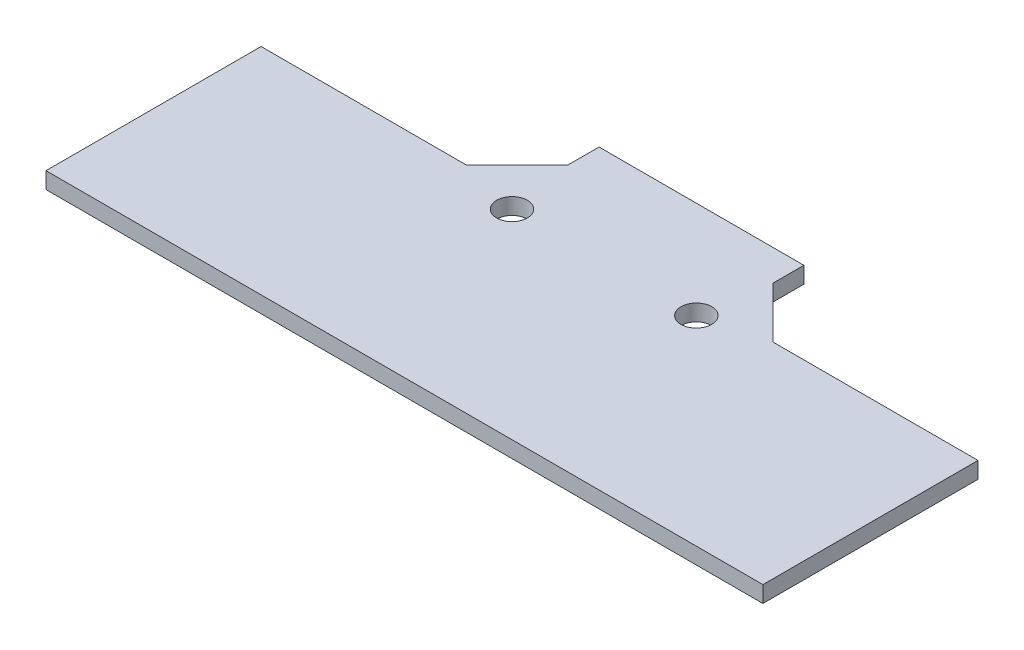
ISO-10303-21;
HEADER;
FILE_DESCRIPTION(('STEP AP214'),'2;1');
FILE_NAME('part.step','',(''),(''),'','','');
FILE_SCHEMA(('AUTOMOTIVE_DESIGN { 1 0 10303 214 1 1 1 1 }'));
ENDSEC;
DATA;
#1=APPLICATION_CONTEXT('core data for automotive mechanical design processes');
#2=APPLICATION_PROTOCOL_DEFINITION('international standard','automotive_design',2000,#1);
#3=PRODUCT_CONTEXT('',#1,'mechanical');
#4=PRODUCT('Part','Part','',(#3));
#5=PRODUCT_RELATED_PRODUCT_CATEGORY('part','',(#4));
#6=PRODUCT_DEFINITION_FORMATION('','',#4);
#7=PRODUCT_DEFINITION_CONTEXT('part definition',#1,'design');
#8=PRODUCT_DEFINITION('design','',#6,#7);
#9=PRODUCT_DEFINITION_SHAPE('','',#8);
#10=(LENGTH_UNIT() NAMED_UNIT(*) SI_UNIT(.MILLI.,.METRE.));
#11=(NAMED_UNIT(*) PLANE_ANGLE_UNIT() SI_UNIT($,.RADIAN.));
#12=(NAMED_UNIT(*) SI_UNIT($,.STERADIAN.) SOLID_ANGLE_UNIT());
#13=UNCERTAINTY_MEASURE_WITH_UNIT(LENGTH_MEASURE(1.E-05),#10,'distance_accuracy_value','');
#14=(GEOMETRIC_REPRESENTATION_CONTEXT(3) GLOBAL_UNCERTAINTY_ASSIGNED_CONTEXT((#13)) GLOBAL_UNIT_ASSIGNED_CONTEXT((#10,
#11,#12)) REPRESENTATION_CONTEXT('',''));
#15=CARTESIAN_POINT('',(0.,0.,0.));
#16=DIRECTION('',(0.,0.,1.));
#17=DIRECTION('',(1.,0.,0.));
#18=AXIS2_PLACEMENT_3D('',#15,#16,#17);
#19=CARTESIAN_POINT('',(0.,1.6,-15.6455542021924));
#20=DIRECTION('',(0.,0.,-1.));
#21=DIRECTION('',(-1.,0.,0.));
#22=AXIS2_PLACEMENT_3D('',#19,#20,#21);
#23=PLANE('',#22);
#24=DIRECTION('',(1.,0.,0.));
#25=VECTOR('',#24,1.);
#26=CARTESIAN_POINT('',(0.,0.,-15.6455542021924));
#27=LINE('',#26,#25);
#28=CARTESIAN_POINT('',(15.2984165651644,0.,-15.6455542021924));
#29=VERTEX_POINT('',#28);
#30=CARTESIAN_POINT('',(35.2984165651644,0.,-15.6455542021924));
#31=VERTEX_POINT('',#30);
#32=EDGE_CURVE('E189',#29,#31,#27,.T.);
#33=ORIENTED_EDGE('',*,*,#32,.F.);
#34=DIRECTION('',(0.,-1.,0.));
#35=VECTOR('',#34,1.);
#36=CARTESIAN_POINT('',(15.2984165651644,1.6,-15.6455542021924));
#37=LINE('',#36,#35);
#38=CARTESIAN_POINT('',(15.2984165651644,1.6,-15.6455542021924));
#39=VERTEX_POINT('',#38);
#40=EDGE_CURVE('E11',#39,#29,#37,.T.);
#41=ORIENTED_EDGE('',*,*,#40,.F.);
#42=DIRECTION('',(1.,0.,0.));
#43=VECTOR('',#42,1.);
#44=CARTESIAN_POINT('',(0.,1.6,-15.6455542021924));
#45=LINE('',#44,#43);
#46=CARTESIAN_POINT('',(35.2984165651644,1.6,-15.6455542021924));
#47=VERTEX_POINT('',#46);
#48=EDGE_CURVE('E283',#39,#47,#45,.T.);
#49=ORIENTED_EDGE('',*,*,#48,.T.);
#50=DIRECTION('',(0.,-1.,0.));
#51=VECTOR('',#50,1.);
#52=CARTESIAN_POINT('',(35.2984165651644,1.6,-15.6455542021924));
#53=LINE('',#52,#51);
#54=EDGE_CURVE('E59',#47,#31,#53,.T.);
#55=ORIENTED_EDGE('',*,*,#54,.T.);
#56=EDGE_LOOP('',(#33,#41,#49,#55));
#57=FACE_BOUND('',#56,.T.);
#58=ADVANCED_FACE('F41',(#57),#23,.T.);
#59=CARTESIAN_POINT('',(15.4719853836784,1.6,-15.4719853836784));
#60=DIRECTION('',(0.707106781186548,0.,-0.707106781186548));
#61=DIRECTION('',(-0.707106781186548,0.,-0.707106781186548));
#62=AXIS2_PLACEMENT_3D('',#59,#60,#61);
#63=PLANE('',#62);
#64=DIRECTION('',(0.707106781186548,0.,0.707106781186548));
#65=VECTOR('',#64,1.);
#66=CARTESIAN_POINT('',(15.4719853836784,0.,-15.4719853836784));
#67=LINE('',#66,#65);
#68=CARTESIAN_POINT('',(10.2984165651644,0.,-20.6455542021924));
#69=VERTEX_POINT('',#68);
#70=EDGE_CURVE('E181',#69,#29,#67,.T.);
#71=ORIENTED_EDGE('',*,*,#70,.F.);
#72=DIRECTION('',(0.,-1.,0.));
#73=VECTOR('',#72,1.);
#74=CARTESIAN_POINT('',(10.2984165651644,1.6,-20.6455542021924));
#75=LINE('',#74,#73);
#76=CARTESIAN_POINT('',(10.2984165651644,1.6,-20.6455542021924));
#77=VERTEX_POINT('',#76);
#78=EDGE_CURVE('E51',#77,#69,#75,.T.);
#79=ORIENTED_EDGE('',*,*,#78,.F.);
#80=DIRECTION('',(0.707106781186548,0.,0.707106781186548));
#81=VECTOR('',#80,1.);
#82=CARTESIAN_POINT('',(15.4719853836784,1.6,-15.4719853836784));
#83=LINE('',#82,#81);
#84=EDGE_CURVE('E287',#77,#39,#83,.T.);
#85=ORIENTED_EDGE('',*,*,#84,.T.);
#86=ORIENTED_EDGE('',*,*,#40,.T.);
#87=EDGE_LOOP('',(#71,#79,#85,#86));
#88=FACE_BOUND('',#87,.T.);
#89=ADVANCED_FACE('F187',(#88),#63,.T.);
#90=CARTESIAN_POINT('',(10.2984165651644,1.6,0.));
#91=DIRECTION('',(-1.,0.,0.));
#92=DIRECTION('',(0.,0.,1.));
#93=AXIS2_PLACEMENT_3D('',#90,#91,#92);
#94=PLANE('',#93);
#95=DIRECTION('',(0.,0.,-1.));
#96=VECTOR('',#95,1.);
#97=CARTESIAN_POINT('',(10.2984165651644,0.,0.));
#98=LINE('',#97,#96);
#99=CARTESIAN_POINT('',(10.2984165651644,0.,-23.6455542021924));
#100=VERTEX_POINT('',#99);
#101=EDGE_CURVE('E171',#69,#100,#98,.T.);
#102=ORIENTED_EDGE('',*,*,#101,.T.);
#103=DIRECTION('',(0.,-1.,0.));
#104=VECTOR('',#103,1.);
#105=CARTESIAN_POINT('',(10.2984165651644,1.6,-23.6455542021924));
#106=LINE('',#105,#104);
#107=CARTESIAN_POINT('',(10.2984165651644,1.6,-23.6455542021924));
#108=VERTEX_POINT('',#107);
#109=EDGE_CURVE('E162',#108,#100,#106,.T.);
#110=ORIENTED_EDGE('',*,*,#109,.F.);
#111=DIRECTION('',(0.,0.,-1.));
#112=VECTOR('',#111,1.);
#113=CARTESIAN_POINT('',(10.2984165651644,1.6,0.));
#114=LINE('',#113,#112);
#115=EDGE_CURVE('E173',#77,#108,#114,.T.);
#116=ORIENTED_EDGE('',*,*,#115,.F.);
#117=ORIENTED_EDGE('',*,*,#78,.T.);
#118=EDGE_LOOP('',(#102,#110,#116,#117));
#119=FACE_BOUND('',#118,.T.);
#120=ADVANCED_FACE('F169',(#119),#94,.F.);
#121=CARTESIAN_POINT('',(0.,1.6,-23.6455542021924));
#122=DIRECTION('',(0.,0.,-1.));
#123=DIRECTION('',(-1.,0.,0.));
#124=AXIS2_PLACEMENT_3D('',#121,#122,#123);
#125=PLANE('',#124);
#126=DIRECTION('',(1.,0.,0.));
#127=VECTOR('',#126,1.);
#128=CARTESIAN_POINT('',(0.,0.,-23.6455542021924));
#129=LINE('',#128,#127);
#130=CARTESIAN_POINT('',(-9.70158343483557,0.,-23.6455542021924));
#131=VERTEX_POINT('',#130);
#132=EDGE_CURVE('E184',#131,#100,#129,.T.);
#133=ORIENTED_EDGE('',*,*,#132,.F.);
#134=DIRECTION('',(0.,-1.,0.));
#135=VECTOR('',#134,1.);
#136=CARTESIAN_POINT('',(-9.70158343483557,1.6,-23.6455542021924));
#137=LINE('',#136,#135);
#138=CARTESIAN_POINT('',(-9.70158343483557,1.6,-23.6455542021924));
#139=VERTEX_POINT('',#138);
#140=EDGE_CURVE('E159',#139,#131,#137,.T.);
#141=ORIENTED_EDGE('',*,*,#140,.F.);
#142=DIRECTION('',(1.,0.,0.));
#143=VECTOR('',#142,1.);
#144=CARTESIAN_POINT('',(0.,1.6,-23.6455542021924));
#145=LINE('',#144,#143);
#146=EDGE_CURVE('E295',#139,#108,#145,.T.);
#147=ORIENTED_EDGE('',*,*,#146,.T.);
#148=ORIENTED_EDGE('',*,*,#109,.T.);
#149=EDGE_LOOP('',(#133,#141,#147,#148));
#150=FACE_BOUND('',#149,.T.);
#151=ADVANCED_FACE('F250',(#150),#125,.T.);
#152=CARTESIAN_POINT('',(-9.70158343483557,1.6,0.));
#153=DIRECTION('',(-1.,0.,0.));
#154=DIRECTION('',(0.,0.,1.));
#155=AXIS2_PLACEMENT_3D('',#152,#153,#154);
#156=PLANE('',#155);
#157=DIRECTION('',(0.,0.,-1.));
#158=VECTOR('',#157,1.);
#159=CARTESIAN_POINT('',(-9.70158343483557,0.,0.));
#160=LINE('',#159,#158);
#161=CARTESIAN_POINT('',(-9.70158343483557,0.,-20.6455542021924));
#162=VERTEX_POINT('',#161);
#163=EDGE_CURVE('E198',#162,#131,#160,.T.);
#164=ORIENTED_EDGE('',*,*,#163,.F.);
#165=DIRECTION('',(0.,-1.,0.));
#166=VECTOR('',#165,1.);
#167=CARTESIAN_POINT('',(-9.70158343483557,1.6,-20.6455542021924));
#168=LINE('',#167,#166);
#169=CARTESIAN_POINT('',(-9.70158343483557,1.6,-20.6455542021924));
#170=VERTEX_POINT('',#169);
#171=EDGE_CURVE('E156',#170,#162,#168,.T.);
#172=ORIENTED_EDGE('',*,*,#171,.F.);
#173=DIRECTION('',(0.,0.,-1.));
#174=VECTOR('',#173,1.);
#175=CARTESIAN_POINT('',(-9.70158343483557,1.6,0.));
#176=LINE('',#175,#174);
#177=EDGE_CURVE('E299',#170,#139,#176,.T.);
#178=ORIENTED_EDGE('',*,*,#177,.T.);
#179=ORIENTED_EDGE('',*,*,#140,.T.);
#180=EDGE_LOOP('',(#164,#172,#178,#179));
#181=FACE_BOUND('',#180,.T.);
#182=ADVANCED_FACE('F253',(#181),#156,.T.);
#183=CARTESIAN_POINT('',(-15.173568818514,1.6,-15.173568818514));
#184=DIRECTION('',(0.707106781186548,0.,0.707106781186548));
#185=DIRECTION('',(0.707106781186548,0.,-0.707106781186548));
#186=AXIS2_PLACEMENT_3D('',#183,#184,#185);
#187=PLANE('',#186);
#188=DIRECTION('',(-0.707106781186548,0.,0.707106781186548));
#189=VECTOR('',#188,1.);
#190=CARTESIAN_POINT('',(-15.173568818514,0.,-15.173568818514));
#191=LINE('',#190,#189);
#192=CARTESIAN_POINT('',(-14.7015834348356,0.,-15.6455542021924));
#193=VERTEX_POINT('',#192);
#194=EDGE_CURVE('E201',#162,#193,#191,.T.);
#195=ORIENTED_EDGE('',*,*,#194,.T.);
#196=DIRECTION('',(0.,-1.,0.));
#197=VECTOR('',#196,1.);
#198=CARTESIAN_POINT('',(-14.7015834348356,1.6,-15.6455542021924));
#199=LINE('',#198,#197);
#200=CARTESIAN_POINT('',(-14.7015834348356,1.6,-15.6455542021924));
#201=VERTEX_POINT('',#200);
#202=EDGE_CURVE('E149',#201,#193,#199,.T.);
#203=ORIENTED_EDGE('',*,*,#202,.F.);
#204=DIRECTION('',(-0.707106781186548,0.,0.707106781186548));
#205=VECTOR('',#204,1.);
#206=CARTESIAN_POINT('',(-15.173568818514,1.6,-15.173568818514));
#207=LINE('',#206,#205);
#208=EDGE_CURVE('E303',#170,#201,#207,.T.);
#209=ORIENTED_EDGE('',*,*,#208,.F.);
#210=ORIENTED_EDGE('',*,*,#171,.T.);
#211=EDGE_LOOP('',(#195,#203,#209,#210));
#212=FACE_BOUND('',#211,.T.);
#213=ADVANCED_FACE('F257',(#212),#187,.F.);
#214=CARTESIAN_POINT('',(0.,1.6,-15.6455542021924));
#215=DIRECTION('',(0.,0.,-1.));
#216=DIRECTION('',(-1.,0.,0.));
#217=AXIS2_PLACEMENT_3D('',#214,#215,#216);
#218=PLANE('',#217);
#219=DIRECTION('',(1.,0.,0.));
#220=VECTOR('',#219,1.);
#221=CARTESIAN_POINT('',(0.,0.,-15.6455542021924));
#222=LINE('',#221,#220);
#223=CARTESIAN_POINT('',(-34.7015834348356,0.,-15.6455542021924));
#224=VERTEX_POINT('',#223);
#225=EDGE_CURVE('E205',#224,#193,#222,.T.);
#226=ORIENTED_EDGE('',*,*,#225,.F.);
#227=DIRECTION('',(0.,-1.,0.));
#228=VECTOR('',#227,1.);
#229=CARTESIAN_POINT('',(-34.7015834348356,1.6,-15.6455542021924));
#230=LINE('',#229,#228);
#231=CARTESIAN_POINT('',(-34.7015834348356,1.6,-15.6455542021924));
#232=VERTEX_POINT('',#231);
#233=EDGE_CURVE('E145',#232,#224,#230,.T.);
#234=ORIENTED_EDGE('',*,*,#233,.F.);
#235=DIRECTION('',(1.,0.,0.));
#236=VECTOR('',#235,1.);
#237=CARTESIAN_POINT('',(0.,1.6,-15.6455542021924));
#238=LINE('',#237,#236);
#239=EDGE_CURVE('E137',#232,#201,#238,.T.);
#240=ORIENTED_EDGE('',*,*,#239,.T.);
#241=ORIENTED_EDGE('',*,*,#202,.T.);
#242=EDGE_LOOP('',(#226,#234,#240,#241));
#243=FACE_BOUND('',#242,.T.);
#244=ADVANCED_FACE('F261',(#243),#218,.T.);
#245=CARTESIAN_POINT('',(-34.7015834348356,1.6,0.));
#246=DIRECTION('',(1.,0.,0.));
#247=DIRECTION('',(0.,0.,-1.));
#248=AXIS2_PLACEMENT_3D('',#245,#246,#247);
#249=PLANE('',#248);
#250=DIRECTION('',(0.,0.,1.));
#251=VECTOR('',#250,1.);
#252=CARTESIAN_POINT('',(-34.7015834348356,0.,0.));
#253=LINE('',#252,#251);
#254=CARTESIAN_POINT('',(-34.7015834348356,0.,5.35444579780758));
#255=VERTEX_POINT('',#254);
#256=EDGE_CURVE('E143',#224,#255,#253,.T.);
#257=ORIENTED_EDGE('',*,*,#256,.T.);
#258=DIRECTION('',(0.,-1.,0.));
#259=VECTOR('',#258,1.);
#260=CARTESIAN_POINT('',(-34.7015834348356,1.6,5.35444579780758));
#261=LINE('',#260,#259);
#262=CARTESIAN_POINT('',(-34.7015834348356,1.6,5.35444579780758));
#263=VERTEX_POINT('',#262);
#264=EDGE_CURVE('E125',#263,#255,#261,.T.);
#265=ORIENTED_EDGE('',*,*,#264,.F.);
#266=DIRECTION('',(0.,0.,1.));
#267=VECTOR('',#266,1.);
#268=CARTESIAN_POINT('',(-34.7015834348356,1.6,0.));
#269=LINE('',#268,#267);
#270=EDGE_CURVE('E131',#232,#263,#269,.T.);
#271=ORIENTED_EDGE('',*,*,#270,.F.);
#272=ORIENTED_EDGE('',*,*,#233,.T.);
#273=EDGE_LOOP('',(#257,#265,#271,#272));
#274=FACE_BOUND('',#273,.T.);
#275=ADVANCED_FACE('F141',(#274),#249,.F.);
#276=CARTESIAN_POINT('',(0.,1.6,5.35444579780758));
#277=DIRECTION('',(0.,0.,-1.));
#278=DIRECTION('',(-1.,0.,0.));
#279=AXIS2_PLACEMENT_3D('',#276,#277,#278);
#280=PLANE('',#279);
#281=DIRECTION('',(1.,0.,0.));
#282=VECTOR('',#281,1.);
#283=CARTESIAN_POINT('',(0.,0.,5.35444579780758));
#284=LINE('',#283,#282);
#285=CARTESIAN_POINT('',(35.2984165651644,0.,5.35444579780758));
#286=VERTEX_POINT('',#285);
#287=EDGE_CURVE('E211',#255,#286,#284,.T.);
#288=ORIENTED_EDGE('',*,*,#287,.T.);
#289=DIRECTION('',(0.,-1.,0.));
#290=VECTOR('',#289,1.);
#291=CARTESIAN_POINT('',(35.2984165651644,1.6,5.35444579780758));
#292=LINE('',#291,#290);
#293=CARTESIAN_POINT('',(35.2984165651644,1.6,5.35444579780758));
#294=VERTEX_POINT('',#293);
#295=EDGE_CURVE('E91',#294,#286,#292,.T.);
#296=ORIENTED_EDGE('',*,*,#295,.F.);
#297=DIRECTION('',(1.,0.,0.));
#298=VECTOR('',#297,1.);
#299=CARTESIAN_POINT('',(0.,1.6,5.35444579780758));
#300=LINE('',#299,#298);
#301=EDGE_CURVE('E121',#263,#294,#300,.T.);
#302=ORIENTED_EDGE('',*,*,#301,.F.);
#303=ORIENTED_EDGE('',*,*,#264,.T.);
#304=EDGE_LOOP('',(#288,#296,#302,#303));
#305=FACE_BOUND('',#304,.T.);
#306=ADVANCED_FACE('F123',(#305),#280,.F.);
#307=CARTESIAN_POINT('',(9.29841656516443,1.6,-14.1455542021924));
#308=DIRECTION('',(0.,-1.,0.));
#309=DIRECTION('',(0.,0.,-1.));
#310=AXIS2_PLACEMENT_3D('',#307,#308,#309);
#311=CYLINDRICAL_SURFACE('',#310,1.5);
#312=CARTESIAN_POINT('',(9.29841656516443,1.6,-14.1455542021924));
#313=DIRECTION('',(0.,1.,0.));
#314=DIRECTION('',(0.,0.,1.));
#315=AXIS2_PLACEMENT_3D('',#312,#313,#314);
#316=CIRCLE('',#315,1.5);
#317=CARTESIAN_POINT('',(9.29841656516443,1.6,-12.6455542021924));
#318=VERTEX_POINT('',#317);
#319=EDGE_CURVE('E281',#318,#318,#316,.T.);
#320=ORIENTED_EDGE('',*,*,#319,.T.);
#321=EDGE_LOOP('',(#320));
#322=FACE_BOUND('',#321,.T.);
#323=CARTESIAN_POINT('',(9.29841656516443,0.,-14.1455542021924));
#324=DIRECTION('',(0.,1.,0.));
#325=DIRECTION('',(0.,0.,1.));
#326=AXIS2_PLACEMENT_3D('',#323,#324,#325);
#327=CIRCLE('',#326,1.5);
#328=CARTESIAN_POINT('',(9.29841656516443,0.,-12.6455542021924));
#329=VERTEX_POINT('',#328);
#330=EDGE_CURVE('E192',#329,#329,#327,.T.);
#331=ORIENTED_EDGE('',*,*,#330,.F.);
#332=EDGE_LOOP('',(#331));
#333=FACE_BOUND('',#332,.T.);
#334=ADVANCED_FACE('F230',(#322,#333),#311,.F.);
#335=CARTESIAN_POINT('',(-8.70158343483557,1.6,-14.1455542021924));
#336=DIRECTION('',(0.,-1.,0.));
#337=DIRECTION('',(0.,0.,-1.));
#338=AXIS2_PLACEMENT_3D('',#335,#336,#337);
#339=CYLINDRICAL_SURFACE('',#338,1.5);
#340=CARTESIAN_POINT('',(-8.70158343483557,1.6,-14.1455542021924));
#341=DIRECTION('',(0.,1.,0.));
#342=DIRECTION('',(0.,0.,1.));
#343=AXIS2_PLACEMENT_3D('',#340,#341,#342);
#344=CIRCLE('',#343,1.5);
#345=CARTESIAN_POINT('',(-8.70158343483557,1.6,-12.6455542021924));
#346=VERTEX_POINT('',#345);
#347=EDGE_CURVE('E217',#346,#346,#344,.T.);
#348=ORIENTED_EDGE('',*,*,#347,.T.);
#349=EDGE_LOOP('',(#348));
#350=FACE_BOUND('',#349,.T.);
#351=CARTESIAN_POINT('',(-8.70158343483557,0.,-14.1455542021924));
#352=DIRECTION('',(0.,1.,0.));
#353=DIRECTION('',(0.,0.,1.));
#354=AXIS2_PLACEMENT_3D('',#351,#352,#353);
#355=CIRCLE('',#354,1.5);
#356=CARTESIAN_POINT('',(-8.70158343483557,0.,-12.6455542021924));
#357=VERTEX_POINT('',#356);
#358=EDGE_CURVE('E222',#357,#357,#355,.T.);
#359=ORIENTED_EDGE('',*,*,#358,.F.);
#360=EDGE_LOOP('',(#359));
#361=FACE_BOUND('',#360,.T.);
#362=ADVANCED_FACE('F43',(#350,#361),#339,.F.);
#363=CARTESIAN_POINT('',(35.2984165651644,1.6,0.));
#364=DIRECTION('',(1.,0.,0.));
#365=DIRECTION('',(0.,0.,-1.));
#366=AXIS2_PLACEMENT_3D('',#363,#364,#365);
#367=PLANE('',#366);
#368=DIRECTION('',(0.,0.,1.));
#369=VECTOR('',#368,1.);
#370=CARTESIAN_POINT('',(35.2984165651644,0.,0.));
#371=LINE('',#370,#369);
#372=EDGE_CURVE('E214',#31,#286,#371,.T.);
#373=ORIENTED_EDGE('',*,*,#372,.F.);
#374=ORIENTED_EDGE('',*,*,#54,.F.);
#375=DIRECTION('',(0.,0.,1.));
#376=VECTOR('',#375,1.);
#377=CARTESIAN_POINT('',(35.2984165651644,1.6,0.));
#378=LINE('',#377,#376);
#379=EDGE_CURVE('E130',#47,#294,#378,.T.);
#380=ORIENTED_EDGE('',*,*,#379,.T.);
#381=ORIENTED_EDGE('',*,*,#295,.T.);
#382=EDGE_LOOP('',(#373,#374,#380,#381));
#383=FACE_BOUND('',#382,.T.);
#384=ADVANCED_FACE('F237',(#383),#367,.T.);
#385=CARTESIAN_POINT('',(0.,1.6,0.));
#386=DIRECTION('',(0.,1.,0.));
#387=DIRECTION('',(0.,0.,1.));
#388=AXIS2_PLACEMENT_3D('',#385,#386,#387);
#389=PLANE('',#388);
#390=ORIENTED_EDGE('',*,*,#347,.F.);
#391=EDGE_LOOP('',(#390));
#392=FACE_BOUND('',#391,.T.);
#393=ORIENTED_EDGE('',*,*,#319,.F.);
#394=EDGE_LOOP('',(#393));
#395=FACE_BOUND('',#394,.T.);
#396=ORIENTED_EDGE('',*,*,#48,.F.);
#397=ORIENTED_EDGE('',*,*,#84,.F.);
#398=ORIENTED_EDGE('',*,*,#115,.T.);
#399=ORIENTED_EDGE('',*,*,#146,.F.);
#400=ORIENTED_EDGE('',*,*,#177,.F.);
#401=ORIENTED_EDGE('',*,*,#208,.T.);
#402=ORIENTED_EDGE('',*,*,#239,.F.);
#403=ORIENTED_EDGE('',*,*,#270,.T.);
#404=ORIENTED_EDGE('',*,*,#301,.T.);
#405=ORIENTED_EDGE('',*,*,#379,.F.);
#406=EDGE_LOOP('',(#396,#397,#398,#399,#400,#401,#402,#403,#404,#405));
#407=FACE_BOUND('',#406,.T.);
#408=ADVANCED_FACE('F135',(#392,#395,#407),#389,.T.);
#409=CARTESIAN_POINT('',(0.,0.,0.));
#410=DIRECTION('',(0.,1.,0.));
#411=DIRECTION('',(0.,0.,1.));
#412=AXIS2_PLACEMENT_3D('',#409,#410,#411);
#413=PLANE('',#412);
#414=ORIENTED_EDGE('',*,*,#358,.T.);
#415=EDGE_LOOP('',(#414));
#416=FACE_BOUND('',#415,.T.);
#417=ORIENTED_EDGE('',*,*,#330,.T.);
#418=EDGE_LOOP('',(#417));
#419=FACE_BOUND('',#418,.T.);
#420=ORIENTED_EDGE('',*,*,#32,.T.);
#421=ORIENTED_EDGE('',*,*,#372,.T.);
#422=ORIENTED_EDGE('',*,*,#287,.F.);
#423=ORIENTED_EDGE('',*,*,#256,.F.);
#424=ORIENTED_EDGE('',*,*,#225,.T.);
#425=ORIENTED_EDGE('',*,*,#194,.F.);
#426=ORIENTED_EDGE('',*,*,#163,.T.);
#427=ORIENTED_EDGE('',*,*,#132,.T.);
#428=ORIENTED_EDGE('',*,*,#101,.F.);
#429=ORIENTED_EDGE('',*,*,#70,.T.);
#430=EDGE_LOOP('',(#420,#421,#422,#423,#424,#425,#426,#427,#428,#429));
#431=FACE_BOUND('',#430,.T.);
#432=ADVANCED_FACE('F180',(#416,#419,#431),#413,.F.);
#433=CLOSED_SHELL('',(#58,#89,#120,#151,#182,#213,#244,#275,#306,#334,#362,#384,#408,#432));
#434=MANIFOLD_SOLID_BREP('B2',#433);
#435=ADVANCED_BREP_SHAPE_REPRESENTATION('',(#18,#434),#14);
#436=SHAPE_DEFINITION_REPRESENTATION(#9,#435);
ENDSEC;
END-ISO-10303-21;
